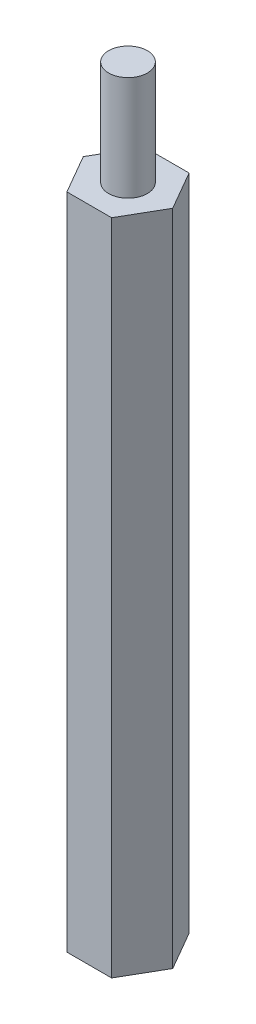
ISO-10303-21;
HEADER;
FILE_DESCRIPTION(('STEP AP214'),'2;1');
FILE_NAME('part.step','',(''),(''),'','','');
FILE_SCHEMA(('AUTOMOTIVE_DESIGN { 1 0 10303 214 1 1 1 1 }'));
ENDSEC;
DATA;
#1=APPLICATION_CONTEXT('core data for automotive mechanical design processes');
#2=APPLICATION_PROTOCOL_DEFINITION('international standard','automotive_design',2000,#1);
#3=PRODUCT_CONTEXT('',#1,'mechanical');
#4=PRODUCT('Part','Part','',(#3));
#5=PRODUCT_RELATED_PRODUCT_CATEGORY('part','',(#4));
#6=PRODUCT_DEFINITION_FORMATION('','',#4);
#7=PRODUCT_DEFINITION_CONTEXT('part definition',#1,'design');
#8=PRODUCT_DEFINITION('design','',#6,#7);
#9=PRODUCT_DEFINITION_SHAPE('','',#8);
#10=(LENGTH_UNIT() NAMED_UNIT(*) SI_UNIT(.MILLI.,.METRE.));
#11=(NAMED_UNIT(*) PLANE_ANGLE_UNIT() SI_UNIT($,.RADIAN.));
#12=(NAMED_UNIT(*) SI_UNIT($,.STERADIAN.) SOLID_ANGLE_UNIT());
#13=UNCERTAINTY_MEASURE_WITH_UNIT(LENGTH_MEASURE(1.E-05),#10,'distance_accuracy_value','');
#14=(GEOMETRIC_REPRESENTATION_CONTEXT(3) GLOBAL_UNCERTAINTY_ASSIGNED_CONTEXT((#13)) GLOBAL_UNIT_ASSIGNED_CONTEXT((#10,
#11,#12)) REPRESENTATION_CONTEXT('',''));
#15=CARTESIAN_POINT('',(0.,0.,0.));
#16=DIRECTION('',(0.,0.,1.));
#17=DIRECTION('',(1.,0.,0.));
#18=AXIS2_PLACEMENT_3D('',#15,#16,#17);
#19=CARTESIAN_POINT('',(-1.73205080756888,51.,-3.));
#20=DIRECTION('',(0.866025403784439,0.,0.5));
#21=DIRECTION('',(0.5,0.,-0.866025403784439));
#22=AXIS2_PLACEMENT_3D('',#19,#20,#21);
#23=PLANE('',#22);
#24=DIRECTION('',(-0.5,0.,0.866025403784439));
#25=VECTOR('',#24,1.);
#26=CARTESIAN_POINT('',(-1.73205080756888,0.,-3.));
#27=LINE('',#26,#25);
#28=CARTESIAN_POINT('',(-1.73205080756888,0.,-3.));
#29=VERTEX_POINT('',#28);
#30=CARTESIAN_POINT('',(-3.46410161513775,0.,0.));
#31=VERTEX_POINT('',#30);
#32=EDGE_CURVE('E134',#29,#31,#27,.T.);
#33=ORIENTED_EDGE('',*,*,#32,.T.);
#34=DIRECTION('',(0.,-1.,0.));
#35=VECTOR('',#34,1.);
#36=CARTESIAN_POINT('',(-3.46410161513775,51.,0.));
#37=LINE('',#36,#35);
#38=CARTESIAN_POINT('',(-3.46410161513775,51.,0.));
#39=VERTEX_POINT('',#38);
#40=EDGE_CURVE('E46',#39,#31,#37,.T.);
#41=ORIENTED_EDGE('',*,*,#40,.F.);
#42=DIRECTION('',(-0.5,0.,0.866025403784439));
#43=VECTOR('',#42,1.);
#44=CARTESIAN_POINT('',(-1.73205080756888,51.,-3.));
#45=LINE('',#44,#43);
#46=CARTESIAN_POINT('',(-1.73205080756888,51.,-3.));
#47=VERTEX_POINT('',#46);
#48=EDGE_CURVE('E151',#47,#39,#45,.T.);
#49=ORIENTED_EDGE('',*,*,#48,.F.);
#50=DIRECTION('',(0.,-1.,0.));
#51=VECTOR('',#50,1.);
#52=CARTESIAN_POINT('',(-1.73205080756888,51.,-3.));
#53=LINE('',#52,#51);
#54=EDGE_CURVE('E130',#47,#29,#53,.T.);
#55=ORIENTED_EDGE('',*,*,#54,.T.);
#56=EDGE_LOOP('',(#33,#41,#49,#55));
#57=FACE_BOUND('',#56,.T.);
#58=ADVANCED_FACE('F43',(#57),#23,.F.);
#59=CARTESIAN_POINT('',(-3.46410161513775,51.,0.));
#60=DIRECTION('',(0.866025403784439,0.,-0.5));
#61=DIRECTION('',(-0.5,0.,-0.866025403784439));
#62=AXIS2_PLACEMENT_3D('',#59,#60,#61);
#63=PLANE('',#62);
#64=DIRECTION('',(0.5,0.,0.866025403784439));
#65=VECTOR('',#64,1.);
#66=CARTESIAN_POINT('',(-3.46410161513775,0.,0.));
#67=LINE('',#66,#65);
#68=CARTESIAN_POINT('',(-1.73205080756888,0.,3.));
#69=VERTEX_POINT('',#68);
#70=EDGE_CURVE('E138',#31,#69,#67,.T.);
#71=ORIENTED_EDGE('',*,*,#70,.T.);
#72=DIRECTION('',(0.,-1.,0.));
#73=VECTOR('',#72,1.);
#74=CARTESIAN_POINT('',(-1.73205080756888,51.,3.));
#75=LINE('',#74,#73);
#76=CARTESIAN_POINT('',(-1.73205080756888,51.,3.));
#77=VERTEX_POINT('',#76);
#78=EDGE_CURVE('E157',#77,#69,#75,.T.);
#79=ORIENTED_EDGE('',*,*,#78,.F.);
#80=DIRECTION('',(0.5,0.,0.866025403784439));
#81=VECTOR('',#80,1.);
#82=CARTESIAN_POINT('',(-3.46410161513775,51.,0.));
#83=LINE('',#82,#81);
#84=EDGE_CURVE('E99',#39,#77,#83,.T.);
#85=ORIENTED_EDGE('',*,*,#84,.F.);
#86=ORIENTED_EDGE('',*,*,#40,.T.);
#87=EDGE_LOOP('',(#71,#79,#85,#86));
#88=FACE_BOUND('',#87,.T.);
#89=ADVANCED_FACE('F164',(#88),#63,.F.);
#90=CARTESIAN_POINT('',(-1.73205080756888,51.,3.));
#91=DIRECTION('',(0.,0.,-1.));
#92=DIRECTION('',(-1.,0.,0.));
#93=AXIS2_PLACEMENT_3D('',#90,#91,#92);
#94=PLANE('',#93);
#95=DIRECTION('',(1.,0.,0.));
#96=VECTOR('',#95,1.);
#97=CARTESIAN_POINT('',(-1.73205080756888,0.,3.));
#98=LINE('',#97,#96);
#99=CARTESIAN_POINT('',(1.73205080756888,0.,3.));
#100=VERTEX_POINT('',#99);
#101=EDGE_CURVE('E142',#69,#100,#98,.T.);
#102=ORIENTED_EDGE('',*,*,#101,.T.);
#103=DIRECTION('',(0.,-1.,0.));
#104=VECTOR('',#103,1.);
#105=CARTESIAN_POINT('',(1.73205080756888,51.,3.));
#106=LINE('',#105,#104);
#107=CARTESIAN_POINT('',(1.73205080756888,51.,3.));
#108=VERTEX_POINT('',#107);
#109=EDGE_CURVE('E123',#108,#100,#106,.T.);
#110=ORIENTED_EDGE('',*,*,#109,.F.);
#111=DIRECTION('',(1.,0.,0.));
#112=VECTOR('',#111,1.);
#113=CARTESIAN_POINT('',(-1.73205080756888,51.,3.));
#114=LINE('',#113,#112);
#115=EDGE_CURVE('E112',#77,#108,#114,.T.);
#116=ORIENTED_EDGE('',*,*,#115,.F.);
#117=ORIENTED_EDGE('',*,*,#78,.T.);
#118=EDGE_LOOP('',(#102,#110,#116,#117));
#119=FACE_BOUND('',#118,.T.);
#120=ADVANCED_FACE('F170',(#119),#94,.F.);
#121=CARTESIAN_POINT('',(1.73205080756888,51.,3.));
#122=DIRECTION('',(-0.866025403784439,0.,-0.5));
#123=DIRECTION('',(-0.5,0.,0.866025403784439));
#124=AXIS2_PLACEMENT_3D('',#121,#122,#123);
#125=PLANE('',#124);
#126=DIRECTION('',(0.5,0.,-0.866025403784439));
#127=VECTOR('',#126,1.);
#128=CARTESIAN_POINT('',(1.73205080756888,0.,3.));
#129=LINE('',#128,#127);
#130=CARTESIAN_POINT('',(3.46410161513775,0.,0.));
#131=VERTEX_POINT('',#130);
#132=EDGE_CURVE('E121',#100,#131,#129,.T.);
#133=ORIENTED_EDGE('',*,*,#132,.T.);
#134=DIRECTION('',(0.,-1.,0.));
#135=VECTOR('',#134,1.);
#136=CARTESIAN_POINT('',(3.46410161513775,51.,0.));
#137=LINE('',#136,#135);
#138=CARTESIAN_POINT('',(3.46410161513775,51.,0.));
#139=VERTEX_POINT('',#138);
#140=EDGE_CURVE('E118',#139,#131,#137,.T.);
#141=ORIENTED_EDGE('',*,*,#140,.F.);
#142=DIRECTION('',(0.5,0.,-0.866025403784439));
#143=VECTOR('',#142,1.);
#144=CARTESIAN_POINT('',(1.73205080756888,51.,3.));
#145=LINE('',#144,#143);
#146=EDGE_CURVE('E106',#108,#139,#145,.T.);
#147=ORIENTED_EDGE('',*,*,#146,.F.);
#148=ORIENTED_EDGE('',*,*,#109,.T.);
#149=EDGE_LOOP('',(#133,#141,#147,#148));
#150=FACE_BOUND('',#149,.T.);
#151=ADVANCED_FACE('F119',(#150),#125,.F.);
#152=CARTESIAN_POINT('',(3.46410161513775,51.,0.));
#153=DIRECTION('',(-0.866025403784439,0.,0.5));
#154=DIRECTION('',(0.5,0.,0.866025403784439));
#155=AXIS2_PLACEMENT_3D('',#152,#153,#154);
#156=PLANE('',#155);
#157=DIRECTION('',(-0.5,0.,-0.866025403784439));
#158=VECTOR('',#157,1.);
#159=CARTESIAN_POINT('',(3.46410161513775,0.,0.));
#160=LINE('',#159,#158);
#161=CARTESIAN_POINT('',(1.73205080756888,0.,-3.));
#162=VERTEX_POINT('',#161);
#163=EDGE_CURVE('E84',#131,#162,#160,.T.);
#164=ORIENTED_EDGE('',*,*,#163,.T.);
#165=DIRECTION('',(0.,-1.,0.));
#166=VECTOR('',#165,1.);
#167=CARTESIAN_POINT('',(1.73205080756888,51.,-3.));
#168=LINE('',#167,#166);
#169=CARTESIAN_POINT('',(1.73205080756888,51.,-3.));
#170=VERTEX_POINT('',#169);
#171=EDGE_CURVE('E124',#170,#162,#168,.T.);
#172=ORIENTED_EDGE('',*,*,#171,.F.);
#173=DIRECTION('',(-0.5,0.,-0.866025403784439));
#174=VECTOR('',#173,1.);
#175=CARTESIAN_POINT('',(3.46410161513775,51.,0.));
#176=LINE('',#175,#174);
#177=EDGE_CURVE('E110',#139,#170,#176,.T.);
#178=ORIENTED_EDGE('',*,*,#177,.F.);
#179=ORIENTED_EDGE('',*,*,#140,.T.);
#180=EDGE_LOOP('',(#164,#172,#178,#179));
#181=FACE_BOUND('',#180,.T.);
#182=ADVANCED_FACE('F126',(#181),#156,.F.);
#183=CARTESIAN_POINT('',(1.73205080756888,51.,-3.));
#184=DIRECTION('',(0.,0.,1.));
#185=DIRECTION('',(1.,0.,0.));
#186=AXIS2_PLACEMENT_3D('',#183,#184,#185);
#187=PLANE('',#186);
#188=DIRECTION('',(-1.,0.,0.));
#189=VECTOR('',#188,1.);
#190=CARTESIAN_POINT('',(1.73205080756888,0.,-3.));
#191=LINE('',#190,#189);
#192=EDGE_CURVE('E90',#162,#29,#191,.T.);
#193=ORIENTED_EDGE('',*,*,#192,.T.);
#194=ORIENTED_EDGE('',*,*,#54,.F.);
#195=DIRECTION('',(-1.,0.,0.));
#196=VECTOR('',#195,1.);
#197=CARTESIAN_POINT('',(1.73205080756888,51.,-3.));
#198=LINE('',#197,#196);
#199=EDGE_CURVE('E61',#170,#47,#198,.T.);
#200=ORIENTED_EDGE('',*,*,#199,.F.);
#201=ORIENTED_EDGE('',*,*,#171,.T.);
#202=EDGE_LOOP('',(#193,#194,#200,#201));
#203=FACE_BOUND('',#202,.T.);
#204=ADVANCED_FACE('F207',(#203),#187,.F.);
#205=CARTESIAN_POINT('',(0.,51.,0.));
#206=DIRECTION('',(0.,1.,0.));
#207=DIRECTION('',(0.,0.,1.));
#208=AXIS2_PLACEMENT_3D('',#205,#206,#207);
#209=PLANE('',#208);
#210=CARTESIAN_POINT('',(0.,51.,0.));
#211=DIRECTION('',(0.,1.,0.));
#212=DIRECTION('',(0.,0.,1.));
#213=AXIS2_PLACEMENT_3D('',#210,#211,#212);
#214=CIRCLE('',#213,1.5);
#215=CARTESIAN_POINT('',(0.,51.,1.5));
#216=VERTEX_POINT('',#215);
#217=EDGE_CURVE('E11',#216,#216,#214,.T.);
#218=ORIENTED_EDGE('',*,*,#217,.F.);
#219=EDGE_LOOP('',(#218));
#220=FACE_BOUND('',#219,.T.);
#221=ORIENTED_EDGE('',*,*,#48,.T.);
#222=ORIENTED_EDGE('',*,*,#84,.T.);
#223=ORIENTED_EDGE('',*,*,#115,.T.);
#224=ORIENTED_EDGE('',*,*,#146,.T.);
#225=ORIENTED_EDGE('',*,*,#177,.T.);
#226=ORIENTED_EDGE('',*,*,#199,.T.);
#227=EDGE_LOOP('',(#221,#222,#223,#224,#225,#226));
#228=FACE_BOUND('',#227,.T.);
#229=ADVANCED_FACE('F108',(#220,#228),#209,.T.);
#230=CARTESIAN_POINT('',(0.,0.,0.));
#231=DIRECTION('',(0.,1.,0.));
#232=DIRECTION('',(0.,0.,1.));
#233=AXIS2_PLACEMENT_3D('',#230,#231,#232);
#234=PLANE('',#233);
#235=CARTESIAN_POINT('',(0.,0.,0.));
#236=DIRECTION('',(0.,-1.,0.));
#237=DIRECTION('',(0.,0.,-1.));
#238=AXIS2_PLACEMENT_3D('',#235,#236,#237);
#239=CIRCLE('',#238,1.5);
#240=CARTESIAN_POINT('',(0.,0.,-1.5));
#241=VERTEX_POINT('',#240);
#242=EDGE_CURVE('E181',#241,#241,#239,.T.);
#243=ORIENTED_EDGE('',*,*,#242,.F.);
#244=EDGE_LOOP('',(#243));
#245=FACE_BOUND('',#244,.T.);
#246=ORIENTED_EDGE('',*,*,#32,.F.);
#247=ORIENTED_EDGE('',*,*,#192,.F.);
#248=ORIENTED_EDGE('',*,*,#163,.F.);
#249=ORIENTED_EDGE('',*,*,#132,.F.);
#250=ORIENTED_EDGE('',*,*,#101,.F.);
#251=ORIENTED_EDGE('',*,*,#70,.F.);
#252=EDGE_LOOP('',(#246,#247,#248,#249,#250,#251));
#253=FACE_BOUND('',#252,.T.);
#254=ADVANCED_FACE('F169',(#245,#253),#234,.F.);
#255=CARTESIAN_POINT('',(0.,59.0916054709663,0.));
#256=DIRECTION('',(0.,-1.,0.));
#257=DIRECTION('',(0.,0.,-1.));
#258=AXIS2_PLACEMENT_3D('',#255,#256,#257);
#259=CYLINDRICAL_SURFACE('',#258,1.5);
#260=CARTESIAN_POINT('',(0.,59.0916054709663,0.));
#261=DIRECTION('',(0.,1.,0.));
#262=DIRECTION('',(0.,0.,1.));
#263=AXIS2_PLACEMENT_3D('',#260,#261,#262);
#264=CIRCLE('',#263,1.5);
#265=CARTESIAN_POINT('',(0.,59.0916054709663,1.5));
#266=VERTEX_POINT('',#265);
#267=EDGE_CURVE('E139',#266,#266,#264,.T.);
#268=ORIENTED_EDGE('',*,*,#267,.F.);
#269=EDGE_LOOP('',(#268));
#270=FACE_BOUND('',#269,.T.);
#271=ORIENTED_EDGE('',*,*,#217,.T.);
#272=EDGE_LOOP('',(#271));
#273=FACE_BOUND('',#272,.T.);
#274=ADVANCED_FACE('F199',(#270,#273),#259,.T.);
#275=CARTESIAN_POINT('',(0.,59.0916054709663,0.));
#276=DIRECTION('',(0.,1.,0.));
#277=DIRECTION('',(0.,0.,1.));
#278=AXIS2_PLACEMENT_3D('',#275,#276,#277);
#279=PLANE('',#278);
#280=ORIENTED_EDGE('',*,*,#267,.T.);
#281=EDGE_LOOP('',(#280));
#282=FACE_BOUND('',#281,.T.);
#283=ADVANCED_FACE('F194',(#282),#279,.T.);
#284=CARTESIAN_POINT('',(0.,4.,0.));
#285=DIRECTION('',(0.,-1.,0.));
#286=DIRECTION('',(0.,0.,-1.));
#287=AXIS2_PLACEMENT_3D('',#284,#285,#286);
#288=CYLINDRICAL_SURFACE('',#287,1.5);
#289=CARTESIAN_POINT('',(0.,4.,0.));
#290=DIRECTION('',(0.,-1.,0.));
#291=DIRECTION('',(0.,0.,-1.));
#292=AXIS2_PLACEMENT_3D('',#289,#290,#291);
#293=CIRCLE('',#292,1.5);
#294=CARTESIAN_POINT('',(0.,4.,-1.5));
#295=VERTEX_POINT('',#294);
#296=EDGE_CURVE('E180',#295,#295,#293,.T.);
#297=ORIENTED_EDGE('',*,*,#296,.F.);
#298=EDGE_LOOP('',(#297));
#299=FACE_BOUND('',#298,.T.);
#300=ORIENTED_EDGE('',*,*,#242,.T.);
#301=EDGE_LOOP('',(#300));
#302=FACE_BOUND('',#301,.T.);
#303=ADVANCED_FACE('F191',(#299,#302),#288,.F.);
#304=CARTESIAN_POINT('',(0.,4.,0.));
#305=DIRECTION('',(0.,-1.,0.));
#306=DIRECTION('',(0.,0.,-1.));
#307=AXIS2_PLACEMENT_3D('',#304,#305,#306);
#308=PLANE('',#307);
#309=ORIENTED_EDGE('',*,*,#296,.T.);
#310=EDGE_LOOP('',(#309));
#311=FACE_BOUND('',#310,.T.);
#312=ADVANCED_FACE('F189',(#311),#308,.T.);
#313=CLOSED_SHELL('',(#58,#89,#120,#151,#182,#204,#229,#254,#274,#283,#303,#312));
#314=MANIFOLD_SOLID_BREP('B2',#313);
#315=ADVANCED_BREP_SHAPE_REPRESENTATION('',(#18,#314),#14);
#316=SHAPE_DEFINITION_REPRESENTATION(#9,#315);
ENDSEC;
END-ISO-10303-21;
